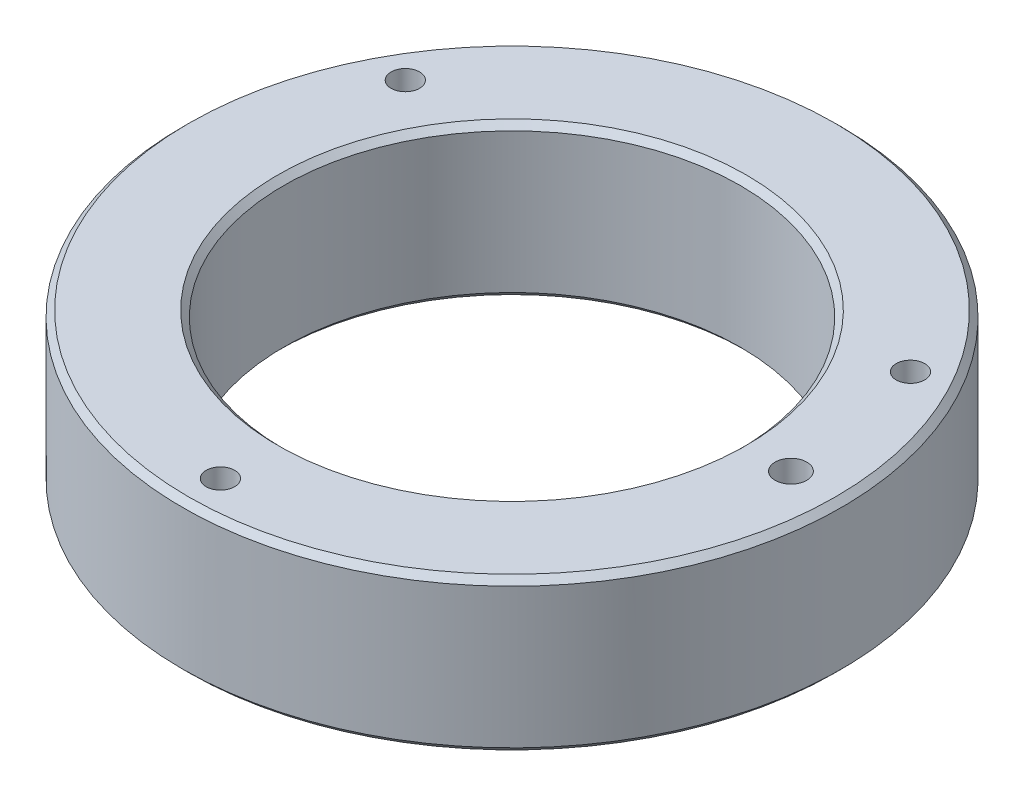
ISO-10303-21;
HEADER;
FILE_DESCRIPTION(('STEP AP214'),'2;1');
FILE_NAME('part.step','',(''),(''),'','','');
FILE_SCHEMA(('AUTOMOTIVE_DESIGN { 1 0 10303 214 1 1 1 1 }'));
ENDSEC;
DATA;
#1=APPLICATION_CONTEXT('core data for automotive mechanical design processes');
#2=APPLICATION_PROTOCOL_DEFINITION('international standard','automotive_design',2000,#1);
#3=PRODUCT_CONTEXT('',#1,'mechanical');
#4=PRODUCT('Part','Part','',(#3));
#5=PRODUCT_RELATED_PRODUCT_CATEGORY('part','',(#4));
#6=PRODUCT_DEFINITION_FORMATION('','',#4);
#7=PRODUCT_DEFINITION_CONTEXT('part definition',#1,'design');
#8=PRODUCT_DEFINITION('design','',#6,#7);
#9=PRODUCT_DEFINITION_SHAPE('','',#8);
#10=(LENGTH_UNIT() NAMED_UNIT(*) SI_UNIT(.MILLI.,.METRE.));
#11=(NAMED_UNIT(*) PLANE_ANGLE_UNIT() SI_UNIT($,.RADIAN.));
#12=(NAMED_UNIT(*) SI_UNIT($,.STERADIAN.) SOLID_ANGLE_UNIT());
#13=UNCERTAINTY_MEASURE_WITH_UNIT(LENGTH_MEASURE(1.E-05),#10,'distance_accuracy_value','');
#14=(GEOMETRIC_REPRESENTATION_CONTEXT(3) GLOBAL_UNCERTAINTY_ASSIGNED_CONTEXT((#13)) GLOBAL_UNIT_ASSIGNED_CONTEXT((#10,
#11,#12)) REPRESENTATION_CONTEXT('',''));
#15=CARTESIAN_POINT('',(0.,0.,0.));
#16=DIRECTION('',(0.,0.,1.));
#17=DIRECTION('',(1.,0.,0.));
#18=AXIS2_PLACEMENT_3D('',#15,#16,#17);
#19=CARTESIAN_POINT('',(-57.15,-19.05,0.));
#20=DIRECTION('',(0.,1.,0.));
#21=DIRECTION('',(0.,0.,1.));
#22=AXIS2_PLACEMENT_3D('',#19,#20,#21);
#23=PLANE('',#22);
#24=CARTESIAN_POINT('',(0.,-19.05,0.));
#25=DIRECTION('',(0.,1.,0.));
#26=DIRECTION('',(0.,0.,1.));
#27=AXIS2_PLACEMENT_3D('',#24,#25,#26);
#28=CIRCLE('',#27,58.674);
#29=CARTESIAN_POINT('',(0.,-19.05,-58.674));
#30=VERTEX_POINT('',#29);
#31=EDGE_CURVE('E57',#30,#30,#28,.T.);
#32=ORIENTED_EDGE('',*,*,#31,.T.);
#33=EDGE_LOOP('',(#32));
#34=FACE_BOUND('',#33,.T.);
#35=CARTESIAN_POINT('',(0.,-19.05,0.));
#36=DIRECTION('',(0.,1.,0.));
#37=DIRECTION('',(0.,0.,1.));
#38=AXIS2_PLACEMENT_3D('',#35,#36,#37);
#39=CIRCLE('',#38,81.0006);
#40=CARTESIAN_POINT('',(0.,-19.05,81.0006));
#41=VERTEX_POINT('',#40);
#42=EDGE_CURVE('E61',#41,#41,#39,.F.);
#43=ORIENTED_EDGE('',*,*,#42,.T.);
#44=EDGE_LOOP('',(#43));
#45=FACE_BOUND('',#44,.T.);
#46=CARTESIAN_POINT('',(69.85,-19.05,0.));
#47=DIRECTION('',(0.,-1.,0.));
#48=DIRECTION('',(0.,0.,-1.));
#49=AXIS2_PLACEMENT_3D('',#46,#47,#48);
#50=CIRCLE('',#49,3.96874999999999);
#51=CARTESIAN_POINT('',(69.85,-19.05,-3.96874999999999));
#52=VERTEX_POINT('',#51);
#53=EDGE_CURVE('E117',#52,#52,#50,.T.);
#54=ORIENTED_EDGE('',*,*,#53,.F.);
#55=EDGE_LOOP('',(#54));
#56=FACE_BOUND('',#55,.T.);
#57=CARTESIAN_POINT('',(0.,-19.05,73.025));
#58=DIRECTION('',(0.,-1.,0.));
#59=DIRECTION('',(0.,0.,-1.));
#60=AXIS2_PLACEMENT_3D('',#57,#58,#59);
#61=CIRCLE('',#60,5.56259999999999);
#62=CARTESIAN_POINT('',(0.,-19.05,67.4624));
#63=VERTEX_POINT('',#62);
#64=EDGE_CURVE('E111',#63,#63,#61,.T.);
#65=ORIENTED_EDGE('',*,*,#64,.F.);
#66=EDGE_LOOP('',(#65));
#67=FACE_BOUND('',#66,.T.);
#68=CARTESIAN_POINT('',(63.246,-19.05,-36.5252));
#69=DIRECTION('',(0.,-1.,0.));
#70=DIRECTION('',(0.,0.,-1.));
#71=AXIS2_PLACEMENT_3D('',#68,#69,#70);
#72=CIRCLE('',#71,5.5626);
#73=CARTESIAN_POINT('',(63.246,-19.05,-42.0878));
#74=VERTEX_POINT('',#73);
#75=EDGE_CURVE('E99',#74,#74,#72,.T.);
#76=ORIENTED_EDGE('',*,*,#75,.F.);
#77=EDGE_LOOP('',(#76));
#78=FACE_BOUND('',#77,.T.);
#79=CARTESIAN_POINT('',(-63.246,-19.05,-36.5252));
#80=DIRECTION('',(0.,-1.,0.));
#81=DIRECTION('',(0.,0.,-1.));
#82=AXIS2_PLACEMENT_3D('',#79,#80,#81);
#83=CIRCLE('',#82,5.56259999999999);
#84=CARTESIAN_POINT('',(-63.246,-19.05,-42.0878));
#85=VERTEX_POINT('',#84);
#86=EDGE_CURVE('E87',#85,#85,#83,.T.);
#87=ORIENTED_EDGE('',*,*,#86,.F.);
#88=EDGE_LOOP('',(#87));
#89=FACE_BOUND('',#88,.T.);
#90=ADVANCED_FACE('F45',(#34,#45,#56,#67,#78,#89),#23,.F.);
#91=CARTESIAN_POINT('',(0.,-44.45,0.));
#92=DIRECTION('',(0.,-1.,0.));
#93=DIRECTION('',(0.,0.,-1.));
#94=AXIS2_PLACEMENT_3D('',#91,#92,#93);
#95=CYLINDRICAL_SURFACE('',#94,82.5246);
#96=CARTESIAN_POINT('',(0.,17.526,0.));
#97=DIRECTION('',(0.,-1.,0.));
#98=DIRECTION('',(0.,0.,-1.));
#99=AXIS2_PLACEMENT_3D('',#96,#97,#98);
#100=CIRCLE('',#99,82.5246);
#101=CARTESIAN_POINT('',(0.,17.526,-82.5246));
#102=VERTEX_POINT('',#101);
#103=EDGE_CURVE('E10',#102,#102,#100,.T.);
#104=ORIENTED_EDGE('',*,*,#103,.T.);
#105=EDGE_LOOP('',(#104));
#106=FACE_BOUND('',#105,.T.);
#107=CARTESIAN_POINT('',(0.,-17.526,0.));
#108=DIRECTION('',(0.,1.,0.));
#109=DIRECTION('',(0.,0.,1.));
#110=AXIS2_PLACEMENT_3D('',#107,#108,#109);
#111=CIRCLE('',#110,82.5246);
#112=CARTESIAN_POINT('',(0.,-17.526,82.5246));
#113=VERTEX_POINT('',#112);
#114=EDGE_CURVE('E53',#113,#113,#111,.T.);
#115=ORIENTED_EDGE('',*,*,#114,.T.);
#116=EDGE_LOOP('',(#115));
#117=FACE_BOUND('',#116,.T.);
#118=ADVANCED_FACE('F125',(#106,#117),#95,.T.);
#119=CARTESIAN_POINT('',(-82.5246,19.05,0.));
#120=DIRECTION('',(0.,-1.,0.));
#121=DIRECTION('',(0.,0.,-1.));
#122=AXIS2_PLACEMENT_3D('',#119,#120,#121);
#123=PLANE('',#122);
#124=CARTESIAN_POINT('',(0.,19.05,0.));
#125=DIRECTION('',(0.,-1.,0.));
#126=DIRECTION('',(0.,0.,-1.));
#127=AXIS2_PLACEMENT_3D('',#124,#125,#126);
#128=CIRCLE('',#127,58.674);
#129=CARTESIAN_POINT('',(0.,19.05,-58.674));
#130=VERTEX_POINT('',#129);
#131=EDGE_CURVE('E72',#130,#130,#128,.T.);
#132=ORIENTED_EDGE('',*,*,#131,.T.);
#133=EDGE_LOOP('',(#132));
#134=FACE_BOUND('',#133,.T.);
#135=CARTESIAN_POINT('',(0.,19.05,0.));
#136=DIRECTION('',(0.,-1.,0.));
#137=DIRECTION('',(0.,0.,-1.));
#138=AXIS2_PLACEMENT_3D('',#135,#136,#137);
#139=CIRCLE('',#138,81.0006);
#140=CARTESIAN_POINT('',(0.,19.05,-81.0006));
#141=VERTEX_POINT('',#140);
#142=EDGE_CURVE('E75',#141,#141,#139,.F.);
#143=ORIENTED_EDGE('',*,*,#142,.T.);
#144=EDGE_LOOP('',(#143));
#145=FACE_BOUND('',#144,.T.);
#146=CARTESIAN_POINT('',(69.85,19.05,0.));
#147=DIRECTION('',(0.,-1.,0.));
#148=DIRECTION('',(0.,0.,-1.));
#149=AXIS2_PLACEMENT_3D('',#146,#147,#148);
#150=CIRCLE('',#149,3.96874999999998);
#151=CARTESIAN_POINT('',(69.85,19.05,-3.96874999999998));
#152=VERTEX_POINT('',#151);
#153=EDGE_CURVE('E114',#152,#152,#150,.T.);
#154=ORIENTED_EDGE('',*,*,#153,.T.);
#155=EDGE_LOOP('',(#154));
#156=FACE_BOUND('',#155,.T.);
#157=CARTESIAN_POINT('',(0.,19.05,73.025));
#158=DIRECTION('',(0.,-1.,0.));
#159=DIRECTION('',(0.,0.,-1.));
#160=AXIS2_PLACEMENT_3D('',#157,#158,#159);
#161=CIRCLE('',#160,3.56869999999999);
#162=CARTESIAN_POINT('',(0.,19.05,69.4563));
#163=VERTEX_POINT('',#162);
#164=EDGE_CURVE('E102',#163,#163,#161,.T.);
#165=ORIENTED_EDGE('',*,*,#164,.T.);
#166=EDGE_LOOP('',(#165));
#167=FACE_BOUND('',#166,.T.);
#168=CARTESIAN_POINT('',(63.246,19.05,-36.5252));
#169=DIRECTION('',(0.,-1.,0.));
#170=DIRECTION('',(0.,0.,-1.));
#171=AXIS2_PLACEMENT_3D('',#168,#169,#170);
#172=CIRCLE('',#171,3.56869999999999);
#173=CARTESIAN_POINT('',(63.246,19.05,-40.0939));
#174=VERTEX_POINT('',#173);
#175=EDGE_CURVE('E90',#174,#174,#172,.T.);
#176=ORIENTED_EDGE('',*,*,#175,.T.);
#177=EDGE_LOOP('',(#176));
#178=FACE_BOUND('',#177,.T.);
#179=CARTESIAN_POINT('',(-63.246,19.05,-36.5252));
#180=DIRECTION('',(0.,-1.,0.));
#181=DIRECTION('',(0.,0.,-1.));
#182=AXIS2_PLACEMENT_3D('',#179,#180,#181);
#183=CIRCLE('',#182,3.56869999999999);
#184=CARTESIAN_POINT('',(-63.246,19.05,-40.0939));
#185=VERTEX_POINT('',#184);
#186=EDGE_CURVE('E78',#185,#185,#183,.T.);
#187=ORIENTED_EDGE('',*,*,#186,.T.);
#188=EDGE_LOOP('',(#187));
#189=FACE_BOUND('',#188,.T.);
#190=ADVANCED_FACE('F159',(#134,#145,#156,#167,#178,#189),#123,.F.);
#191=CARTESIAN_POINT('',(0.,-44.45,0.));
#192=DIRECTION('',(0.,-1.,0.));
#193=DIRECTION('',(0.,0.,-1.));
#194=AXIS2_PLACEMENT_3D('',#191,#192,#193);
#195=CYLINDRICAL_SURFACE('',#194,57.15);
#196=CARTESIAN_POINT('',(0.,17.526,0.));
#197=DIRECTION('',(0.,-1.,0.));
#198=DIRECTION('',(0.,0.,-1.));
#199=AXIS2_PLACEMENT_3D('',#196,#197,#198);
#200=CIRCLE('',#199,57.15);
#201=CARTESIAN_POINT('',(0.,17.526,-57.15));
#202=VERTEX_POINT('',#201);
#203=EDGE_CURVE('E66',#202,#202,#200,.F.);
#204=CARTESIAN_POINT('',(0.,-17.526,0.));
#205=DIRECTION('',(0.,1.,0.));
#206=DIRECTION('',(0.,0.,1.));
#207=AXIS2_PLACEMENT_3D('',#204,#205,#206);
#208=CIRCLE('',#207,57.15);
#209=CARTESIAN_POINT('',(0.,-17.526,-57.15));
#210=VERTEX_POINT('',#209);
#211=EDGE_CURVE('E69',#210,#210,#208,.F.);
#212=CARTESIAN_POINT('',(0.,17.526,-57.15));
#213=CARTESIAN_POINT('',(0.,17.160875,-57.15));
#214=CARTESIAN_POINT('',(0.,16.79575,-57.15));
#215=CARTESIAN_POINT('',(0.,16.0655,-57.15));
#216=CARTESIAN_POINT('',(0.,15.700375,-57.15));
#217=CARTESIAN_POINT('',(0.,14.970125,-57.15));
#218=CARTESIAN_POINT('',(0.,14.605,-57.15));
#219=CARTESIAN_POINT('',(0.,13.87475,-57.15));
#220=CARTESIAN_POINT('',(0.,13.509625,-57.15));
#221=CARTESIAN_POINT('',(0.,12.779375,-57.15));
#222=CARTESIAN_POINT('',(0.,12.41425,-57.15));
#223=CARTESIAN_POINT('',(0.,11.684,-57.15));
#224=CARTESIAN_POINT('',(0.,11.318875,-57.15));
#225=CARTESIAN_POINT('',(0.,10.588625,-57.15));
#226=CARTESIAN_POINT('',(0.,10.2235,-57.15));
#227=CARTESIAN_POINT('',(0.,9.49324999999998,-57.15));
#228=CARTESIAN_POINT('',(0.,9.12812499999998,-57.15));
#229=CARTESIAN_POINT('',(0.,8.39787499999998,-57.15));
#230=CARTESIAN_POINT('',(0.,8.03274999999998,-57.15));
#231=CARTESIAN_POINT('',(0.,7.30249999999998,-57.15));
#232=CARTESIAN_POINT('',(0.,6.93737499999998,-57.15));
#233=CARTESIAN_POINT('',(0.,6.20712499999998,-57.15));
#234=CARTESIAN_POINT('',(0.,5.84199999999998,-57.15));
#235=CARTESIAN_POINT('',(0.,5.11174999999998,-57.15));
#236=CARTESIAN_POINT('',(0.,4.74662499999998,-57.15));
#237=CARTESIAN_POINT('',(0.,4.01637499999998,-57.15));
#238=CARTESIAN_POINT('',(0.,3.65124999999998,-57.15));
#239=CARTESIAN_POINT('',(0.,2.92099999999998,-57.15));
#240=CARTESIAN_POINT('',(0.,2.55587499999998,-57.15));
#241=CARTESIAN_POINT('',(0.,1.82562499999998,-57.15));
#242=CARTESIAN_POINT('',(0.,1.46049999999998,-57.15));
#243=CARTESIAN_POINT('',(0.,0.730249999999976,-57.15));
#244=CARTESIAN_POINT('',(0.,0.365124999999978,-57.15));
#245=CARTESIAN_POINT('',(0.,-0.365125000000019,-57.15));
#246=CARTESIAN_POINT('',(0.,-0.730250000000018,-57.15));
#247=CARTESIAN_POINT('',(0.,-1.46050000000002,-57.15));
#248=CARTESIAN_POINT('',(0.,-1.82562500000002,-57.15));
#249=CARTESIAN_POINT('',(0.,-2.55587500000002,-57.15));
#250=CARTESIAN_POINT('',(0.,-2.92100000000002,-57.15));
#251=CARTESIAN_POINT('',(0.,-3.65125000000002,-57.15));
#252=CARTESIAN_POINT('',(0.,-4.01637500000002,-57.15));
#253=CARTESIAN_POINT('',(0.,-4.74662500000002,-57.15));
#254=CARTESIAN_POINT('',(0.,-5.11175000000002,-57.15));
#255=CARTESIAN_POINT('',(0.,-5.84200000000002,-57.15));
#256=CARTESIAN_POINT('',(0.,-6.20712500000002,-57.15));
#257=CARTESIAN_POINT('',(0.,-6.93737500000002,-57.15));
#258=CARTESIAN_POINT('',(0.,-7.30250000000002,-57.15));
#259=CARTESIAN_POINT('',(0.,-8.03275000000002,-57.15));
#260=CARTESIAN_POINT('',(0.,-8.39787500000002,-57.15));
#261=CARTESIAN_POINT('',(0.,-9.12812500000002,-57.15));
#262=CARTESIAN_POINT('',(0.,-9.49325000000002,-57.15));
#263=CARTESIAN_POINT('',(0.,-10.2235,-57.15));
#264=CARTESIAN_POINT('',(0.,-10.588625,-57.15));
#265=CARTESIAN_POINT('',(0.,-11.318875,-57.15));
#266=CARTESIAN_POINT('',(0.,-11.684,-57.15));
#267=CARTESIAN_POINT('',(0.,-12.41425,-57.15));
#268=CARTESIAN_POINT('',(0.,-12.779375,-57.15));
#269=CARTESIAN_POINT('',(0.,-13.509625,-57.15));
#270=CARTESIAN_POINT('',(0.,-13.87475,-57.15));
#271=CARTESIAN_POINT('',(0.,-14.605,-57.15));
#272=CARTESIAN_POINT('',(0.,-14.970125,-57.15));
#273=CARTESIAN_POINT('',(0.,-15.700375,-57.15));
#274=CARTESIAN_POINT('',(0.,-16.0655,-57.15));
#275=CARTESIAN_POINT('',(0.,-16.79575,-57.15));
#276=CARTESIAN_POINT('',(0.,-17.160875,-57.15));
#277=CARTESIAN_POINT('',(0.,-17.526,-57.15));
#278=B_SPLINE_CURVE_WITH_KNOTS('',3,(#212,#213,#214,#215,#216,#217,#218,#219,#220,#221,#222,
#223,#224,#225,#226,#227,#228,#229,#230,#231,#232,#233,#234,#235,#236,#237,#238,#239,#240,#241,
#242,#243,#244,#245,#246,#247,#248,#249,#250,#251,#252,#253,#254,#255,#256,#257,#258,#259,#260,
#261,#262,#263,#264,#265,#266,#267,#268,#269,#270,#271,#272,#273,#274,#275,#276,#277),
.UNSPECIFIED.,.F.,.F.,(4,2,2,2,2,2,2,2,2,2,2,2,2,2,2,2,2,2,2,2,2,2,2,2,2,2,2,2,2,2,2,2,4),(0.,
1.095375,2.19075,3.286125,4.3815,5.476875,6.57225,7.667625,8.763,9.858375,10.95375,12.049125,
13.1445,14.239875,15.33525,16.430625,17.526,18.621375,19.71675,20.812125,21.9075,23.002875,
24.09825,25.193625,26.289,27.384375,28.47975,29.575125,30.6705,31.765875,32.86125,33.956625,
35.052),.UNSPECIFIED.);
#279=EDGE_CURVE('BSEAM155',#202,#210,#278,.T.);
#280=ORIENTED_EDGE('',*,*,#203,.T.);
#281=ORIENTED_EDGE('',*,*,#211,.T.);
#282=ORIENTED_EDGE('',*,*,#279,.T.);
#283=ORIENTED_EDGE('',*,*,#279,.F.);
#284=EDGE_LOOP('',(#280,#282,#281,#283));
#285=FACE_BOUND('',#284,.T.);
#286=ADVANCED_FACE('F155',(#285),#195,.F.);
#287=CARTESIAN_POINT('',(-63.246,-19.05,-36.5252));
#288=DIRECTION('',(0.,-1.,0.));
#289=DIRECTION('',(0.,0.,-1.));
#290=AXIS2_PLACEMENT_3D('',#287,#288,#289);
#291=CYLINDRICAL_SURFACE('',#290,3.56869999999999);
#292=ORIENTED_EDGE('',*,*,#186,.F.);
#293=EDGE_LOOP('',(#292));
#294=FACE_BOUND('',#293,.T.);
#295=CARTESIAN_POINT('',(-63.246,-9.39800000000001,-36.5252));
#296=DIRECTION('',(0.,-1.,0.));
#297=DIRECTION('',(0.,0.,-1.));
#298=AXIS2_PLACEMENT_3D('',#295,#296,#297);
#299=CIRCLE('',#298,3.56869999999999);
#300=CARTESIAN_POINT('',(-63.246,-9.39800000000001,-40.0939));
#301=VERTEX_POINT('',#300);
#302=EDGE_CURVE('E81',#301,#301,#299,.T.);
#303=ORIENTED_EDGE('',*,*,#302,.T.);
#304=EDGE_LOOP('',(#303));
#305=FACE_BOUND('',#304,.T.);
#306=ADVANCED_FACE('F147',(#294,#305),#291,.F.);
#307=CARTESIAN_POINT('',(-59.6773,-9.398,-36.5252));
#308=DIRECTION('',(0.,1.,0.));
#309=DIRECTION('',(0.,0.,1.));
#310=AXIS2_PLACEMENT_3D('',#307,#308,#309);
#311=PLANE('',#310);
#312=ORIENTED_EDGE('',*,*,#302,.F.);
#313=EDGE_LOOP('',(#312));
#314=FACE_BOUND('',#313,.T.);
#315=CARTESIAN_POINT('',(-63.246,-9.398,-36.5252));
#316=DIRECTION('',(0.,-1.,0.));
#317=DIRECTION('',(0.,0.,-1.));
#318=AXIS2_PLACEMENT_3D('',#315,#316,#317);
#319=CIRCLE('',#318,5.56259999999999);
#320=CARTESIAN_POINT('',(-63.246,-9.398,-42.0878));
#321=VERTEX_POINT('',#320);
#322=EDGE_CURVE('E84',#321,#321,#319,.T.);
#323=ORIENTED_EDGE('',*,*,#322,.T.);
#324=EDGE_LOOP('',(#323));
#325=FACE_BOUND('',#324,.T.);
#326=ADVANCED_FACE('F137',(#314,#325),#311,.F.);
#327=CARTESIAN_POINT('',(-63.246,-19.05,-36.5252));
#328=DIRECTION('',(0.,-1.,0.));
#329=DIRECTION('',(0.,0.,-1.));
#330=AXIS2_PLACEMENT_3D('',#327,#328,#329);
#331=CYLINDRICAL_SURFACE('',#330,5.56259999999999);
#332=ORIENTED_EDGE('',*,*,#322,.F.);
#333=EDGE_LOOP('',(#332));
#334=FACE_BOUND('',#333,.T.);
#335=ORIENTED_EDGE('',*,*,#86,.T.);
#336=EDGE_LOOP('',(#335));
#337=FACE_BOUND('',#336,.T.);
#338=ADVANCED_FACE('F134',(#334,#337),#331,.F.);
#339=CARTESIAN_POINT('',(63.246,-19.05,-36.5252));
#340=DIRECTION('',(0.,-1.,0.));
#341=DIRECTION('',(0.,0.,-1.));
#342=AXIS2_PLACEMENT_3D('',#339,#340,#341);
#343=CYLINDRICAL_SURFACE('',#342,3.56869999999999);
#344=ORIENTED_EDGE('',*,*,#175,.F.);
#345=EDGE_LOOP('',(#344));
#346=FACE_BOUND('',#345,.T.);
#347=CARTESIAN_POINT('',(63.246,-9.39800000000001,-36.5252));
#348=DIRECTION('',(0.,-1.,0.));
#349=DIRECTION('',(0.,0.,-1.));
#350=AXIS2_PLACEMENT_3D('',#347,#348,#349);
#351=CIRCLE('',#350,3.56869999999998);
#352=CARTESIAN_POINT('',(63.246,-9.39800000000001,-40.0939));
#353=VERTEX_POINT('',#352);
#354=EDGE_CURVE('E93',#353,#353,#351,.T.);
#355=ORIENTED_EDGE('',*,*,#354,.T.);
#356=EDGE_LOOP('',(#355));
#357=FACE_BOUND('',#356,.T.);
#358=ADVANCED_FACE('F136',(#346,#357),#343,.F.);
#359=CARTESIAN_POINT('',(66.8147,-9.398,-36.5252));
#360=DIRECTION('',(0.,1.,0.));
#361=DIRECTION('',(0.,0.,1.));
#362=AXIS2_PLACEMENT_3D('',#359,#360,#361);
#363=PLANE('',#362);
#364=ORIENTED_EDGE('',*,*,#354,.F.);
#365=EDGE_LOOP('',(#364));
#366=FACE_BOUND('',#365,.T.);
#367=CARTESIAN_POINT('',(63.246,-9.398,-36.5252));
#368=DIRECTION('',(0.,-1.,0.));
#369=DIRECTION('',(0.,0.,-1.));
#370=AXIS2_PLACEMENT_3D('',#367,#368,#369);
#371=CIRCLE('',#370,5.5626);
#372=CARTESIAN_POINT('',(63.246,-9.398,-42.0878));
#373=VERTEX_POINT('',#372);
#374=EDGE_CURVE('E96',#373,#373,#371,.T.);
#375=ORIENTED_EDGE('',*,*,#374,.T.);
#376=EDGE_LOOP('',(#375));
#377=FACE_BOUND('',#376,.T.);
#378=ADVANCED_FACE('F144',(#366,#377),#363,.F.);
#379=CARTESIAN_POINT('',(63.246,-19.05,-36.5252));
#380=DIRECTION('',(0.,-1.,0.));
#381=DIRECTION('',(0.,0.,-1.));
#382=AXIS2_PLACEMENT_3D('',#379,#380,#381);
#383=CYLINDRICAL_SURFACE('',#382,5.5626);
#384=ORIENTED_EDGE('',*,*,#374,.F.);
#385=EDGE_LOOP('',(#384));
#386=FACE_BOUND('',#385,.T.);
#387=ORIENTED_EDGE('',*,*,#75,.T.);
#388=EDGE_LOOP('',(#387));
#389=FACE_BOUND('',#388,.T.);
#390=ADVANCED_FACE('F208',(#386,#389),#383,.F.);
#391=CARTESIAN_POINT('',(0.,-19.05,73.025));
#392=DIRECTION('',(0.,-1.,0.));
#393=DIRECTION('',(0.,0.,-1.));
#394=AXIS2_PLACEMENT_3D('',#391,#392,#393);
#395=CYLINDRICAL_SURFACE('',#394,3.56869999999999);
#396=ORIENTED_EDGE('',*,*,#164,.F.);
#397=EDGE_LOOP('',(#396));
#398=FACE_BOUND('',#397,.T.);
#399=CARTESIAN_POINT('',(0.,-9.39800000000001,73.025));
#400=DIRECTION('',(0.,-1.,0.));
#401=DIRECTION('',(0.,0.,-1.));
#402=AXIS2_PLACEMENT_3D('',#399,#400,#401);
#403=CIRCLE('',#402,3.56869999999999);
#404=CARTESIAN_POINT('',(0.,-9.39800000000001,69.4563));
#405=VERTEX_POINT('',#404);
#406=EDGE_CURVE('E105',#405,#405,#403,.T.);
#407=ORIENTED_EDGE('',*,*,#406,.T.);
#408=EDGE_LOOP('',(#407));
#409=FACE_BOUND('',#408,.T.);
#410=ADVANCED_FACE('F213',(#398,#409),#395,.F.);
#411=CARTESIAN_POINT('',(3.56869999999999,-9.398,73.025));
#412=DIRECTION('',(0.,1.,0.));
#413=DIRECTION('',(0.,0.,1.));
#414=AXIS2_PLACEMENT_3D('',#411,#412,#413);
#415=PLANE('',#414);
#416=ORIENTED_EDGE('',*,*,#406,.F.);
#417=EDGE_LOOP('',(#416));
#418=FACE_BOUND('',#417,.T.);
#419=CARTESIAN_POINT('',(0.,-9.398,73.025));
#420=DIRECTION('',(0.,-1.,0.));
#421=DIRECTION('',(0.,0.,-1.));
#422=AXIS2_PLACEMENT_3D('',#419,#420,#421);
#423=CIRCLE('',#422,5.56259999999999);
#424=CARTESIAN_POINT('',(0.,-9.398,67.4624));
#425=VERTEX_POINT('',#424);
#426=EDGE_CURVE('E108',#425,#425,#423,.T.);
#427=ORIENTED_EDGE('',*,*,#426,.T.);
#428=EDGE_LOOP('',(#427));
#429=FACE_BOUND('',#428,.T.);
#430=ADVANCED_FACE('F218',(#418,#429),#415,.F.);
#431=CARTESIAN_POINT('',(0.,-19.05,73.025));
#432=DIRECTION('',(0.,-1.,0.));
#433=DIRECTION('',(0.,0.,-1.));
#434=AXIS2_PLACEMENT_3D('',#431,#432,#433);
#435=CYLINDRICAL_SURFACE('',#434,5.56259999999999);
#436=ORIENTED_EDGE('',*,*,#426,.F.);
#437=EDGE_LOOP('',(#436));
#438=FACE_BOUND('',#437,.T.);
#439=ORIENTED_EDGE('',*,*,#64,.T.);
#440=EDGE_LOOP('',(#439));
#441=FACE_BOUND('',#440,.T.);
#442=ADVANCED_FACE('F224',(#438,#441),#435,.F.);
#443=CARTESIAN_POINT('',(69.85,-19.05,0.));
#444=DIRECTION('',(0.,-1.,0.));
#445=DIRECTION('',(0.,0.,-1.));
#446=AXIS2_PLACEMENT_3D('',#443,#444,#445);
#447=CYLINDRICAL_SURFACE('',#446,3.96874999999999);
#448=ORIENTED_EDGE('',*,*,#153,.F.);
#449=EDGE_LOOP('',(#448));
#450=FACE_BOUND('',#449,.T.);
#451=ORIENTED_EDGE('',*,*,#53,.T.);
#452=EDGE_LOOP('',(#451));
#453=FACE_BOUND('',#452,.T.);
#454=ADVANCED_FACE('F121',(#450,#453),#447,.F.);
#455=CARTESIAN_POINT('',(0.,19.05,0.));
#456=DIRECTION('',(0.,1.,0.));
#457=DIRECTION('',(0.,0.,1.));
#458=AXIS2_PLACEMENT_3D('',#455,#456,#457);
#459=CONICAL_SURFACE('',#458,58.674,0.785398163397435);
#460=ORIENTED_EDGE('',*,*,#203,.F.);
#461=EDGE_LOOP('',(#460));
#462=FACE_BOUND('',#461,.T.);
#463=ORIENTED_EDGE('',*,*,#131,.F.);
#464=EDGE_LOOP('',(#463));
#465=FACE_BOUND('',#464,.T.);
#466=ADVANCED_FACE('F167',(#462,#465),#459,.F.);
#467=CARTESIAN_POINT('',(0.,-17.526,0.));
#468=DIRECTION('',(0.,-1.,0.));
#469=DIRECTION('',(0.,0.,-1.));
#470=AXIS2_PLACEMENT_3D('',#467,#468,#469);
#471=CONICAL_SURFACE('',#470,57.15,0.785398163397451);
#472=CARTESIAN_POINT('',(0.,-19.05,-58.674));
#473=CARTESIAN_POINT('',(0.,-19.034125,-58.658125));
#474=CARTESIAN_POINT('',(0.,-19.01825,-58.64225));
#475=CARTESIAN_POINT('',(0.,-18.9865,-58.6105));
#476=CARTESIAN_POINT('',(0.,-18.970625,-58.594625));
#477=CARTESIAN_POINT('',(0.,-18.938875,-58.562875));
#478=CARTESIAN_POINT('',(0.,-18.923,-58.547));
#479=CARTESIAN_POINT('',(0.,-18.89125,-58.51525));
#480=CARTESIAN_POINT('',(0.,-18.875375,-58.499375));
#481=CARTESIAN_POINT('',(0.,-18.843625,-58.467625));
#482=CARTESIAN_POINT('',(0.,-18.82775,-58.45175));
#483=CARTESIAN_POINT('',(0.,-18.796,-58.42));
#484=CARTESIAN_POINT('',(0.,-18.780125,-58.404125));
#485=CARTESIAN_POINT('',(0.,-18.748375,-58.372375));
#486=CARTESIAN_POINT('',(0.,-18.7325,-58.3565));
#487=CARTESIAN_POINT('',(0.,-18.70075,-58.32475));
#488=CARTESIAN_POINT('',(0.,-18.684875,-58.308875));
#489=CARTESIAN_POINT('',(0.,-18.653125,-58.277125));
#490=CARTESIAN_POINT('',(0.,-18.63725,-58.26125));
#491=CARTESIAN_POINT('',(0.,-18.6055,-58.2295));
#492=CARTESIAN_POINT('',(0.,-18.589625,-58.213625));
#493=CARTESIAN_POINT('',(0.,-18.557875,-58.181875));
#494=CARTESIAN_POINT('',(0.,-18.542,-58.166));
#495=CARTESIAN_POINT('',(0.,-18.51025,-58.13425));
#496=CARTESIAN_POINT('',(0.,-18.494375,-58.118375));
#497=CARTESIAN_POINT('',(0.,-18.462625,-58.086625));
#498=CARTESIAN_POINT('',(0.,-18.44675,-58.07075));
#499=CARTESIAN_POINT('',(0.,-18.415,-58.039));
#500=CARTESIAN_POINT('',(0.,-18.399125,-58.023125));
#501=CARTESIAN_POINT('',(0.,-18.367375,-57.991375));
#502=CARTESIAN_POINT('',(0.,-18.3515,-57.9755));
#503=CARTESIAN_POINT('',(0.,-18.31975,-57.94375));
#504=CARTESIAN_POINT('',(0.,-18.303875,-57.927875));
#505=CARTESIAN_POINT('',(0.,-18.272125,-57.896125));
#506=CARTESIAN_POINT('',(0.,-18.25625,-57.88025));
#507=CARTESIAN_POINT('',(0.,-18.2245,-57.8485));
#508=CARTESIAN_POINT('',(0.,-18.208625,-57.832625));
#509=CARTESIAN_POINT('',(0.,-18.176875,-57.800875));
#510=CARTESIAN_POINT('',(0.,-18.161,-57.785));
#511=CARTESIAN_POINT('',(0.,-18.12925,-57.75325));
#512=CARTESIAN_POINT('',(0.,-18.113375,-57.737375));
#513=CARTESIAN_POINT('',(0.,-18.081625,-57.705625));
#514=CARTESIAN_POINT('',(0.,-18.06575,-57.68975));
#515=CARTESIAN_POINT('',(0.,-18.034,-57.658));
#516=CARTESIAN_POINT('',(0.,-18.018125,-57.642125));
#517=CARTESIAN_POINT('',(0.,-17.986375,-57.610375));
#518=CARTESIAN_POINT('',(0.,-17.9705,-57.5945));
#519=CARTESIAN_POINT('',(0.,-17.93875,-57.56275));
#520=CARTESIAN_POINT('',(0.,-17.922875,-57.546875));
#521=CARTESIAN_POINT('',(0.,-17.891125,-57.515125));
#522=CARTESIAN_POINT('',(0.,-17.87525,-57.49925));
#523=CARTESIAN_POINT('',(0.,-17.8435,-57.4675));
#524=CARTESIAN_POINT('',(0.,-17.827625,-57.451625));
#525=CARTESIAN_POINT('',(0.,-17.795875,-57.419875));
#526=CARTESIAN_POINT('',(0.,-17.78,-57.404));
#527=CARTESIAN_POINT('',(0.,-17.74825,-57.37225));
#528=CARTESIAN_POINT('',(0.,-17.732375,-57.356375));
#529=CARTESIAN_POINT('',(0.,-17.700625,-57.324625));
#530=CARTESIAN_POINT('',(0.,-17.68475,-57.30875));
#531=CARTESIAN_POINT('',(0.,-17.653,-57.277));
#532=CARTESIAN_POINT('',(0.,-17.637125,-57.261125));
#533=CARTESIAN_POINT('',(0.,-17.605375,-57.229375));
#534=CARTESIAN_POINT('',(0.,-17.5895,-57.2135));
#535=CARTESIAN_POINT('',(0.,-17.55775,-57.18175));
#536=CARTESIAN_POINT('',(0.,-17.541875,-57.165875));
#537=CARTESIAN_POINT('',(0.,-17.526,-57.15));
#538=B_SPLINE_CURVE_WITH_KNOTS('',3,(#472,#473,#474,#475,#476,#477,#478,#479,#480,#481,#482,
#483,#484,#485,#486,#487,#488,#489,#490,#491,#492,#493,#494,#495,#496,#497,#498,#499,#500,#501,
#502,#503,#504,#505,#506,#507,#508,#509,#510,#511,#512,#513,#514,#515,#516,#517,#518,#519,#520,
#521,#522,#523,#524,#525,#526,#527,#528,#529,#530,#531,#532,#533,#534,#535,#536,#537),
.UNSPECIFIED.,.F.,.F.,(4,2,2,2,2,2,2,2,2,2,2,2,2,2,2,2,2,2,2,2,2,2,2,2,2,2,2,2,2,2,2,2,4),(0.,
0.0673519209080149,0.134703841816037,0.202055762724052,0.269407683632072,0.336759604540087,
0.404111525448106,0.471463446356126,0.538815367264141,0.606167288172161,0.673519209080176,
0.740871129988195,0.80822305089621,0.87557497180423,0.94292689271225,1.01027881362026,
1.07763073452828,1.1449826554363,1.21233457634432,1.27968649725234,1.34703841816036,
1.41439033906838,1.48174225997639,1.54909418088441,1.61644610179242,1.68379802270044,
1.75114994360846,1.81850186451648,1.88585378542449,1.95320570633251,2.02055762724053,
2.08790954814855,2.15526146905657),.UNSPECIFIED.);
#539=EDGE_CURVE('BSEAM173',#30,#210,#538,.T.);
#540=ORIENTED_EDGE('',*,*,#31,.F.);
#541=ORIENTED_EDGE('',*,*,#211,.F.);
#542=ORIENTED_EDGE('',*,*,#539,.T.);
#543=ORIENTED_EDGE('',*,*,#539,.F.);
#544=EDGE_LOOP('',(#540,#542,#541,#543));
#545=FACE_BOUND('',#544,.T.);
#546=ADVANCED_FACE('F173',(#545),#471,.F.);
#547=CARTESIAN_POINT('',(0.,17.526,0.));
#548=DIRECTION('',(0.,-1.,0.));
#549=DIRECTION('',(0.,0.,-1.));
#550=AXIS2_PLACEMENT_3D('',#547,#548,#549);
#551=CONICAL_SURFACE('',#550,82.5246,0.785398163397451);
#552=ORIENTED_EDGE('',*,*,#142,.F.);
#553=EDGE_LOOP('',(#552));
#554=FACE_BOUND('',#553,.T.);
#555=ORIENTED_EDGE('',*,*,#103,.F.);
#556=EDGE_LOOP('',(#555));
#557=FACE_BOUND('',#556,.T.);
#558=ADVANCED_FACE('F179',(#554,#557),#551,.T.);
#559=CARTESIAN_POINT('',(0.,-19.05,0.));
#560=DIRECTION('',(0.,1.,0.));
#561=DIRECTION('',(0.,0.,1.));
#562=AXIS2_PLACEMENT_3D('',#559,#560,#561);
#563=CONICAL_SURFACE('',#562,81.0006,0.785398163397448);
#564=ORIENTED_EDGE('',*,*,#114,.F.);
#565=EDGE_LOOP('',(#564));
#566=FACE_BOUND('',#565,.T.);
#567=ORIENTED_EDGE('',*,*,#42,.F.);
#568=EDGE_LOOP('',(#567));
#569=FACE_BOUND('',#568,.T.);
#570=ADVANCED_FACE('F48',(#566,#569),#563,.T.);
#571=CLOSED_SHELL('',(#90,#118,#190,#286,#306,#326,#338,#358,#378,#390,#410,#430,#442,#454,#466,
#546,#558,#570));
#572=MANIFOLD_SOLID_BREP('B2',#571);
#573=ADVANCED_BREP_SHAPE_REPRESENTATION('',(#18,#572),#14);
#574=SHAPE_DEFINITION_REPRESENTATION(#9,#573);
ENDSEC;
END-ISO-10303-21;
